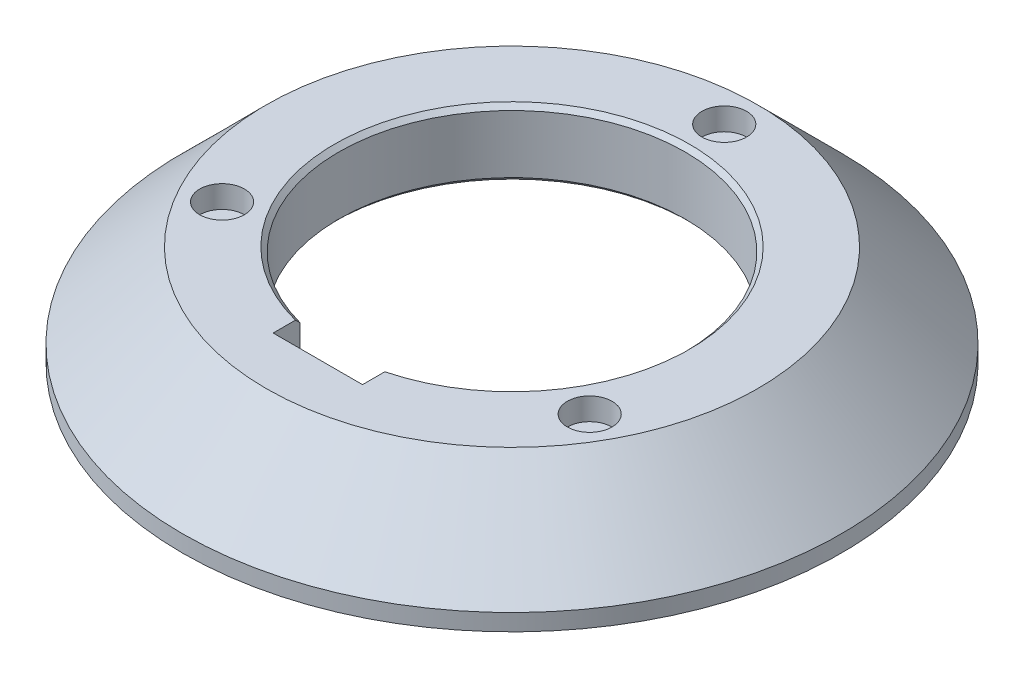
ISO-10303-21;
HEADER;
FILE_DESCRIPTION(('STEP AP214'),'2;1');
FILE_NAME('part.step','',(''),(''),'','','');
FILE_SCHEMA(('AUTOMOTIVE_DESIGN { 1 0 10303 214 1 1 1 1 }'));
ENDSEC;
DATA;
#1=APPLICATION_CONTEXT('core data for automotive mechanical design processes');
#2=APPLICATION_PROTOCOL_DEFINITION('international standard','automotive_design',2000,#1);
#3=PRODUCT_CONTEXT('',#1,'mechanical');
#4=PRODUCT('Part','Part','',(#3));
#5=PRODUCT_RELATED_PRODUCT_CATEGORY('part','',(#4));
#6=PRODUCT_DEFINITION_FORMATION('','',#4);
#7=PRODUCT_DEFINITION_CONTEXT('part definition',#1,'design');
#8=PRODUCT_DEFINITION('design','',#6,#7);
#9=PRODUCT_DEFINITION_SHAPE('','',#8);
#10=(LENGTH_UNIT() NAMED_UNIT(*) SI_UNIT(.MILLI.,.METRE.));
#11=(NAMED_UNIT(*) PLANE_ANGLE_UNIT() SI_UNIT($,.RADIAN.));
#12=(NAMED_UNIT(*) SI_UNIT($,.STERADIAN.) SOLID_ANGLE_UNIT());
#13=UNCERTAINTY_MEASURE_WITH_UNIT(LENGTH_MEASURE(1.E-05),#10,'distance_accuracy_value','');
#14=(GEOMETRIC_REPRESENTATION_CONTEXT(3) GLOBAL_UNCERTAINTY_ASSIGNED_CONTEXT((#13)) GLOBAL_UNIT_ASSIGNED_CONTEXT((#10,
#11,#12)) REPRESENTATION_CONTEXT('',''));
#15=CARTESIAN_POINT('',(0.,0.,0.));
#16=DIRECTION('',(0.,0.,1.));
#17=DIRECTION('',(1.,0.,0.));
#18=AXIS2_PLACEMENT_3D('',#15,#16,#17);
#19=CARTESIAN_POINT('',(110.,30.,0.));
#20=DIRECTION('',(0.,-1.,0.));
#21=DIRECTION('',(0.,0.,-1.));
#22=AXIS2_PLACEMENT_3D('',#19,#20,#21);
#23=PLANE('',#22);
#24=CARTESIAN_POINT('',(-82.2724133595215,30.,47.5000000000004));
#25=DIRECTION('',(0.,1.,0.));
#26=DIRECTION('',(0.866025403784436,0.,-0.500000000000004));
#27=AXIS2_PLACEMENT_3D('',#24,#25,#26);
#28=CIRCLE('',#27,10.);
#29=CARTESIAN_POINT('',(-73.6121593216771,30.,42.5000000000003));
#30=VERTEX_POINT('',#29);
#31=EDGE_CURVE('E131',#30,#30,#28,.T.);
#32=ORIENTED_EDGE('',*,*,#31,.F.);
#33=EDGE_LOOP('',(#32));
#34=FACE_BOUND('',#33,.T.);
#35=CARTESIAN_POINT('',(82.2724133595221,30.,47.4999999999992));
#36=DIRECTION('',(0.,1.,0.));
#37=DIRECTION('',(-0.866025403784443,0.,-0.499999999999992));
#38=AXIS2_PLACEMENT_3D('',#35,#36,#37);
#39=CIRCLE('',#38,10.);
#40=CARTESIAN_POINT('',(73.6121593216777,30.,42.4999999999993));
#41=VERTEX_POINT('',#40);
#42=EDGE_CURVE('E116',#41,#41,#39,.T.);
#43=ORIENTED_EDGE('',*,*,#42,.F.);
#44=EDGE_LOOP('',(#43));
#45=FACE_BOUND('',#44,.T.);
#46=CARTESIAN_POINT('',(0.,30.,-95.));
#47=DIRECTION('',(0.,1.,0.));
#48=DIRECTION('',(0.,0.,1.));
#49=AXIS2_PLACEMENT_3D('',#46,#47,#48);
#50=CIRCLE('',#49,10.);
#51=CARTESIAN_POINT('',(0.,30.,-85.));
#52=VERTEX_POINT('',#51);
#53=EDGE_CURVE('E130',#52,#52,#50,.T.);
#54=ORIENTED_EDGE('',*,*,#53,.F.);
#55=EDGE_LOOP('',(#54));
#56=FACE_BOUND('',#55,.T.);
#57=DIRECTION('',(-1.,0.,0.));
#58=VECTOR('',#57,1.);
#59=CARTESIAN_POINT('',(110.,30.,86.9));
#60=LINE('',#59,#58);
#61=CARTESIAN_POINT('',(20.,30.,86.9));
#62=VERTEX_POINT('',#61);
#63=CARTESIAN_POINT('',(-20.,30.,86.9));
#64=VERTEX_POINT('',#63);
#65=EDGE_CURVE('E107',#62,#64,#60,.T.);
#66=ORIENTED_EDGE('',*,*,#65,.T.);
#67=DIRECTION('',(0.,0.,-1.));
#68=VECTOR('',#67,1.);
#69=CARTESIAN_POINT('',(-20.,30.,0.));
#70=LINE('',#69,#68);
#71=CARTESIAN_POINT('',(-19.999999183372,30.0000087539034,76.943165574341));
#72=VERTEX_POINT('',#71);
#73=EDGE_CURVE('E118',#64,#72,#70,.T.);
#74=ORIENTED_EDGE('',*,*,#73,.T.);
#75=CARTESIAN_POINT('',(0.,30.,0.));
#76=DIRECTION('',(0.,-1.,0.));
#77=DIRECTION('',(0.,0.,-1.));
#78=AXIS2_PLACEMENT_3D('',#75,#76,#77);
#79=CIRCLE('',#78,79.5);
#80=CARTESIAN_POINT('',(19.9999991833721,30.0000087539034,76.943165574341));
#81=VERTEX_POINT('',#80);
#82=EDGE_CURVE('E166',#72,#81,#79,.T.);
#83=ORIENTED_EDGE('',*,*,#82,.T.);
#84=DIRECTION('',(0.,0.,1.));
#85=VECTOR('',#84,1.);
#86=CARTESIAN_POINT('',(20.,30.,0.));
#87=LINE('',#86,#85);
#88=EDGE_CURVE('E54',#81,#62,#87,.T.);
#89=ORIENTED_EDGE('',*,*,#88,.T.);
#90=EDGE_LOOP('',(#66,#74,#83,#89));
#91=FACE_BOUND('',#90,.T.);
#92=CARTESIAN_POINT('',(0.,30.,0.));
#93=DIRECTION('',(0.,1.,0.));
#94=DIRECTION('',(0.,0.,1.));
#95=AXIS2_PLACEMENT_3D('',#92,#93,#94);
#96=CIRCLE('',#95,110.);
#97=CARTESIAN_POINT('',(0.,30.,110.));
#98=VERTEX_POINT('',#97);
#99=EDGE_CURVE('E142',#98,#98,#96,.T.);
#100=ORIENTED_EDGE('',*,*,#99,.T.);
#101=EDGE_LOOP('',(#100));
#102=FACE_BOUND('',#101,.T.);
#103=ADVANCED_FACE('F37',(#34,#45,#56,#91,#102),#23,.F.);
#104=CARTESIAN_POINT('',(0.,107.750556792873,0.));
#105=DIRECTION('',(0.,1.,0.));
#106=DIRECTION('',(0.,0.,1.));
#107=AXIS2_PLACEMENT_3D('',#104,#105,#106);
#108=CYLINDRICAL_SURFACE('',#107,77.5);
#109=CARTESIAN_POINT('',(0.,28.,0.));
#110=DIRECTION('',(0.,-1.,0.));
#111=DIRECTION('',(0.,0.,-1.));
#112=AXIS2_PLACEMENT_3D('',#109,#110,#111);
#113=CIRCLE('',#112,77.5);
#114=CARTESIAN_POINT('',(20.,28.,74.8748956593597));
#115=VERTEX_POINT('',#114);
#116=CARTESIAN_POINT('',(-20.,28.,74.8748956593597));
#117=VERTEX_POINT('',#116);
#118=EDGE_CURVE('E160',#115,#117,#113,.F.);
#119=ORIENTED_EDGE('',*,*,#118,.T.);
#120=DIRECTION('',(0.,1.,0.));
#121=VECTOR('',#120,1.);
#122=CARTESIAN_POINT('',(-20.,107.750556792873,74.8748956593597));
#123=LINE('',#122,#121);
#124=CARTESIAN_POINT('',(-20.,2.00000000000003,74.8748956593597));
#125=VERTEX_POINT('',#124);
#126=EDGE_CURVE('E101',#117,#125,#123,.F.);
#127=ORIENTED_EDGE('',*,*,#126,.T.);
#128=CARTESIAN_POINT('',(0.,2.00000000000003,0.));
#129=DIRECTION('',(0.,1.,0.));
#130=DIRECTION('',(0.,0.,1.));
#131=AXIS2_PLACEMENT_3D('',#128,#129,#130);
#132=CIRCLE('',#131,77.5);
#133=CARTESIAN_POINT('',(20.,2.00000000000003,74.8748956593597));
#134=VERTEX_POINT('',#133);
#135=EDGE_CURVE('E163',#125,#134,#132,.F.);
#136=ORIENTED_EDGE('',*,*,#135,.T.);
#137=DIRECTION('',(0.,1.,0.));
#138=VECTOR('',#137,1.);
#139=CARTESIAN_POINT('',(20.,107.750556792873,74.8748956593597));
#140=LINE('',#139,#138);
#141=EDGE_CURVE('E108',#134,#115,#140,.T.);
#142=ORIENTED_EDGE('',*,*,#141,.T.);
#143=EDGE_LOOP('',(#119,#127,#136,#142));
#144=FACE_BOUND('',#143,.T.);
#145=ADVANCED_FACE('F209',(#144),#108,.F.);
#146=CARTESIAN_POINT('',(77.5,0.,0.));
#147=DIRECTION('',(0.,1.,0.));
#148=DIRECTION('',(0.,0.,1.));
#149=AXIS2_PLACEMENT_3D('',#146,#147,#148);
#150=PLANE('',#149);
#151=CARTESIAN_POINT('',(100.,0.,-3.49148133884313E-13));
#152=DIRECTION('',(0.,-1.,0.));
#153=DIRECTION('',(-1.,0.,0.));
#154=AXIS2_PLACEMENT_3D('',#151,#152,#153);
#155=CIRCLE('',#154,4.);
#156=CARTESIAN_POINT('',(96.,0.,-3.35182208528941E-13));
#157=VERTEX_POINT('',#156);
#158=EDGE_CURVE('E313',#157,#157,#155,.T.);
#159=ORIENTED_EDGE('',*,*,#158,.F.);
#160=EDGE_LOOP('',(#159));
#161=FACE_BOUND('',#160,.T.);
#162=CARTESIAN_POINT('',(70.7106781186544,0.,-70.7106781186551));
#163=DIRECTION('',(0.,-1.,0.));
#164=DIRECTION('',(-0.707106781186544,0.,0.707106781186551));
#165=AXIS2_PLACEMENT_3D('',#162,#163,#164);
#166=CIRCLE('',#165,4.);
#167=CARTESIAN_POINT('',(67.8822509939082,0.,-67.8822509939089));
#168=VERTEX_POINT('',#167);
#169=EDGE_CURVE('E307',#168,#168,#166,.T.);
#170=ORIENTED_EDGE('',*,*,#169,.F.);
#171=EDGE_LOOP('',(#170));
#172=FACE_BOUND('',#171,.T.);
#173=CARTESIAN_POINT('',(0.,0.,-100.));
#174=DIRECTION('',(0.,-1.,0.));
#175=DIRECTION('',(0.,0.,1.));
#176=AXIS2_PLACEMENT_3D('',#173,#174,#175);
#177=CIRCLE('',#176,4.);
#178=CARTESIAN_POINT('',(0.,0.,-96.));
#179=VERTEX_POINT('',#178);
#180=EDGE_CURVE('E301',#179,#179,#177,.T.);
#181=ORIENTED_EDGE('',*,*,#180,.F.);
#182=EDGE_LOOP('',(#181));
#183=FACE_BOUND('',#182,.T.);
#184=CARTESIAN_POINT('',(-70.7106781186554,0.,-70.7106781186541));
#185=DIRECTION('',(0.,-1.,0.));
#186=DIRECTION('',(0.707106781186554,0.,0.707106781186541));
#187=AXIS2_PLACEMENT_3D('',#184,#185,#186);
#188=CIRCLE('',#187,4.);
#189=CARTESIAN_POINT('',(-67.8822509939092,0.,-67.882250993908));
#190=VERTEX_POINT('',#189);
#191=EDGE_CURVE('E294',#190,#190,#188,.T.);
#192=ORIENTED_EDGE('',*,*,#191,.F.);
#193=EDGE_LOOP('',(#192));
#194=FACE_BOUND('',#193,.T.);
#195=CARTESIAN_POINT('',(-100.,0.,1.04744440165294E-12));
#196=DIRECTION('',(0.,-1.,0.));
#197=DIRECTION('',(1.,0.,0.));
#198=AXIS2_PLACEMENT_3D('',#195,#196,#197);
#199=CIRCLE('',#198,4.);
#200=CARTESIAN_POINT('',(-96.,0.,1.00554662558682E-12));
#201=VERTEX_POINT('',#200);
#202=EDGE_CURVE('E324',#201,#201,#199,.T.);
#203=ORIENTED_EDGE('',*,*,#202,.F.);
#204=EDGE_LOOP('',(#203));
#205=FACE_BOUND('',#204,.T.);
#206=CARTESIAN_POINT('',(-70.7106781186539,0.,70.7106781186556));
#207=DIRECTION('',(0.,-1.,0.));
#208=DIRECTION('',(0.707106781186539,0.,-0.707106781186556));
#209=AXIS2_PLACEMENT_3D('',#206,#207,#208);
#210=CIRCLE('',#209,4.);
#211=CARTESIAN_POINT('',(-67.8822509939077,0.,67.8822509939094));
#212=VERTEX_POINT('',#211);
#213=EDGE_CURVE('E318',#212,#212,#210,.T.);
#214=ORIENTED_EDGE('',*,*,#213,.F.);
#215=EDGE_LOOP('',(#214));
#216=FACE_BOUND('',#215,.T.);
#217=CARTESIAN_POINT('',(70.7106781186549,0.,70.7106781186546));
#218=DIRECTION('',(0.,-1.,0.));
#219=DIRECTION('',(-0.707106781186549,0.,-0.707106781186546));
#220=AXIS2_PLACEMENT_3D('',#217,#218,#219);
#221=CIRCLE('',#220,4.);
#222=CARTESIAN_POINT('',(67.8822509939087,0.,67.8822509939085));
#223=VERTEX_POINT('',#222);
#224=EDGE_CURVE('E288',#223,#223,#221,.T.);
#225=ORIENTED_EDGE('',*,*,#224,.F.);
#226=EDGE_LOOP('',(#225));
#227=FACE_BOUND('',#226,.T.);
#228=CARTESIAN_POINT('',(0.,0.,100.));
#229=DIRECTION('',(0.,-1.,0.));
#230=DIRECTION('',(0.,0.,-1.));
#231=AXIS2_PLACEMENT_3D('',#228,#229,#230);
#232=CIRCLE('',#231,4.);
#233=CARTESIAN_POINT('',(0.,0.,96.));
#234=VERTEX_POINT('',#233);
#235=EDGE_CURVE('E282',#234,#234,#232,.T.);
#236=ORIENTED_EDGE('',*,*,#235,.F.);
#237=EDGE_LOOP('',(#236));
#238=FACE_BOUND('',#237,.T.);
#239=CARTESIAN_POINT('',(0.,0.,0.));
#240=DIRECTION('',(0.,1.,0.));
#241=DIRECTION('',(0.,0.,1.));
#242=AXIS2_PLACEMENT_3D('',#239,#240,#241);
#243=CIRCLE('',#242,79.5);
#244=CARTESIAN_POINT('',(20.,0.,76.9431608396744));
#245=VERTEX_POINT('',#244);
#246=CARTESIAN_POINT('',(-20.,0.,76.9431608396744));
#247=VERTEX_POINT('',#246);
#248=EDGE_CURVE('E113',#245,#247,#243,.T.);
#249=ORIENTED_EDGE('',*,*,#248,.T.);
#250=DIRECTION('',(0.,0.,1.));
#251=VECTOR('',#250,1.);
#252=CARTESIAN_POINT('',(-20.,0.,0.));
#253=LINE('',#252,#251);
#254=CARTESIAN_POINT('',(-20.,0.,86.9));
#255=VERTEX_POINT('',#254);
#256=EDGE_CURVE('E62',#247,#255,#253,.T.);
#257=ORIENTED_EDGE('',*,*,#256,.T.);
#258=DIRECTION('',(1.,0.,0.));
#259=VECTOR('',#258,1.);
#260=CARTESIAN_POINT('',(77.5,0.,86.9));
#261=LINE('',#260,#259);
#262=CARTESIAN_POINT('',(20.,0.,86.9));
#263=VERTEX_POINT('',#262);
#264=EDGE_CURVE('E11',#255,#263,#261,.T.);
#265=ORIENTED_EDGE('',*,*,#264,.T.);
#266=DIRECTION('',(0.,0.,-1.));
#267=VECTOR('',#266,1.);
#268=CARTESIAN_POINT('',(20.,0.,0.));
#269=LINE('',#268,#267);
#270=EDGE_CURVE('E92',#263,#245,#269,.T.);
#271=ORIENTED_EDGE('',*,*,#270,.T.);
#272=EDGE_LOOP('',(#249,#257,#265,#271));
#273=FACE_BOUND('',#272,.T.);
#274=CARTESIAN_POINT('',(0.,0.,0.));
#275=DIRECTION('',(0.,1.,0.));
#276=DIRECTION('',(0.,0.,1.));
#277=AXIS2_PLACEMENT_3D('',#274,#275,#276);
#278=CIRCLE('',#277,117.5);
#279=CARTESIAN_POINT('',(0.,0.,117.5));
#280=VERTEX_POINT('',#279);
#281=EDGE_CURVE('E156',#280,#280,#278,.T.);
#282=ORIENTED_EDGE('',*,*,#281,.F.);
#283=EDGE_LOOP('',(#282));
#284=FACE_BOUND('',#283,.T.);
#285=ADVANCED_FACE('F111',(#161,#172,#183,#194,#205,#216,#227,#238,#273,#284),#150,.F.);
#286=CARTESIAN_POINT('',(0.,0.,0.));
#287=DIRECTION('',(0.,-1.,0.));
#288=DIRECTION('',(0.,0.,-1.));
#289=AXIS2_PLACEMENT_3D('',#286,#287,#288);
#290=CONICAL_SURFACE('',#289,117.5,0.785398163397447);
#291=CARTESIAN_POINT('',(0.,-15.,0.));
#292=DIRECTION('',(0.,1.,0.));
#293=DIRECTION('',(0.,0.,1.));
#294=AXIS2_PLACEMENT_3D('',#291,#292,#293);
#295=CIRCLE('',#294,132.5);
#296=CARTESIAN_POINT('',(0.,-15.,132.5));
#297=VERTEX_POINT('',#296);
#298=EDGE_CURVE('E153',#297,#297,#295,.T.);
#299=ORIENTED_EDGE('',*,*,#298,.F.);
#300=EDGE_LOOP('',(#299));
#301=FACE_BOUND('',#300,.T.);
#302=ORIENTED_EDGE('',*,*,#281,.T.);
#303=EDGE_LOOP('',(#302));
#304=FACE_BOUND('',#303,.T.);
#305=ADVANCED_FACE('F216',(#301,#304),#290,.F.);
#306=CARTESIAN_POINT('',(132.5,-15.,0.));
#307=DIRECTION('',(0.,1.,0.));
#308=DIRECTION('',(0.,0.,1.));
#309=AXIS2_PLACEMENT_3D('',#306,#307,#308);
#310=PLANE('',#309);
#311=CARTESIAN_POINT('',(0.,-15.,0.));
#312=DIRECTION('',(0.,1.,0.));
#313=DIRECTION('',(0.,0.,1.));
#314=AXIS2_PLACEMENT_3D('',#311,#312,#313);
#315=CIRCLE('',#314,147.5);
#316=CARTESIAN_POINT('',(0.,-15.,147.5));
#317=VERTEX_POINT('',#316);
#318=EDGE_CURVE('E150',#317,#317,#315,.T.);
#319=ORIENTED_EDGE('',*,*,#318,.F.);
#320=EDGE_LOOP('',(#319));
#321=FACE_BOUND('',#320,.T.);
#322=ORIENTED_EDGE('',*,*,#298,.T.);
#323=EDGE_LOOP('',(#322));
#324=FACE_BOUND('',#323,.T.);
#325=ADVANCED_FACE('F220',(#321,#324),#310,.F.);
#326=CARTESIAN_POINT('',(0.,107.750556792873,0.));
#327=DIRECTION('',(0.,1.,0.));
#328=DIRECTION('',(0.,0.,1.));
#329=AXIS2_PLACEMENT_3D('',#326,#327,#328);
#330=CYLINDRICAL_SURFACE('',#329,147.5);
#331=CARTESIAN_POINT('',(0.,-7.5000000000001,0.));
#332=DIRECTION('',(0.,1.,0.));
#333=DIRECTION('',(0.,0.,1.));
#334=AXIS2_PLACEMENT_3D('',#331,#332,#333);
#335=CIRCLE('',#334,147.5);
#336=CARTESIAN_POINT('',(0.,-7.5000000000001,147.5));
#337=VERTEX_POINT('',#336);
#338=EDGE_CURVE('E147',#337,#337,#335,.T.);
#339=ORIENTED_EDGE('',*,*,#338,.F.);
#340=EDGE_LOOP('',(#339));
#341=FACE_BOUND('',#340,.T.);
#342=ORIENTED_EDGE('',*,*,#318,.T.);
#343=EDGE_LOOP('',(#342));
#344=FACE_BOUND('',#343,.T.);
#345=ADVANCED_FACE('F224',(#341,#344),#330,.T.);
#346=CARTESIAN_POINT('',(0.,-7.5000000000001,0.));
#347=DIRECTION('',(0.,-1.,0.));
#348=DIRECTION('',(0.,0.,-1.));
#349=AXIS2_PLACEMENT_3D('',#346,#347,#348);
#350=CONICAL_SURFACE('',#349,147.5,0.785398163397447);
#351=ORIENTED_EDGE('',*,*,#99,.F.);
#352=EDGE_LOOP('',(#351));
#353=FACE_BOUND('',#352,.T.);
#354=ORIENTED_EDGE('',*,*,#338,.T.);
#355=EDGE_LOOP('',(#354));
#356=FACE_BOUND('',#355,.T.);
#357=ADVANCED_FACE('F204',(#353,#356),#350,.T.);
#358=CARTESIAN_POINT('',(0.,0.,0.));
#359=DIRECTION('',(0.,-1.,0.));
#360=DIRECTION('',(0.,0.,-1.));
#361=AXIS2_PLACEMENT_3D('',#358,#359,#360);
#362=CONICAL_SURFACE('',#361,79.5,0.785398163397441);
#363=CARTESIAN_POINT('',(-20.,-17.5684312119772,94.9856849106975));
#364=CARTESIAN_POINT('',(-20.,-16.0097924913469,93.3928472974872));
#365=CARTESIAN_POINT('',(-20.,-14.4519817757735,91.7991986225075));
#366=CARTESIAN_POINT('',(-20.,-11.3383457901811,88.6099617932942));
#367=CARTESIAN_POINT('',(-20.,-9.78252052094745,87.0143736382942));
#368=CARTESIAN_POINT('',(-20.,-6.67321620346296,83.8209726736292));
#369=CARTESIAN_POINT('',(-20.,-5.11973711035972,82.2231599076445));
#370=CARTESIAN_POINT('',(-20.,-2.01552747081061,79.02486686309));
#371=CARTESIAN_POINT('',(-20.,-0.4647969237774,77.4243865850903));
#372=CARTESIAN_POINT('',(-20.,2.63339750207828,74.2202237529315));
#373=CARTESIAN_POINT('',(-20.,4.18086133553764,72.6165411548974));
#374=CARTESIAN_POINT('',(-20.,7.271804411606,69.4053439372526));
#375=CARTESIAN_POINT('',(-20.,8.81528365975796,67.7978293229788));
#376=CARTESIAN_POINT('',(-20.,11.8973897349149,64.5780925799859));
#377=CARTESIAN_POINT('',(-20.,13.4360164677237,62.9658703610395));
#378=CARTESIAN_POINT('',(-20.,15.7393910224165,60.5431891470597));
#379=CARTESIAN_POINT('',(-20.,16.5064234991292,59.7349020997113));
#380=CARTESIAN_POINT('',(-20.,18.0387677175682,58.1166970803101));
#381=CARTESIAN_POINT('',(-20.,18.8040794574747,57.3067791065341));
#382=CARTESIAN_POINT('',(-20.,19.5684312119773,56.49595505338));
#383=B_SPLINE_CURVE_WITH_KNOTS('',3,(#363,#364,#365,#366,#367,#368,#369,#370,#371,#372,#373,
#374,#375,#376,#377,#378,#379,#380,#381,#382),.UNSPECIFIED.,.F.,.F.,(4,2,2,2,2,2,2,2,2,4),(0.,
6.68568506223245,13.3713727677386,20.0569310011246,26.742487805724,33.4281368463093,
40.1137765814846,46.7995453080812,50.1424461297198,53.4853504850127),.UNSPECIFIED.);
#384=EDGE_CURVE('E114',#247,#125,#383,.T.);
#385=ORIENTED_EDGE('',*,*,#384,.F.);
#386=ORIENTED_EDGE('',*,*,#248,.F.);
#387=CARTESIAN_POINT('',(20.,19.5684312119773,56.49595505338));
#388=CARTESIAN_POINT('',(20.,18.8040794574747,57.3067791065341));
#389=CARTESIAN_POINT('',(20.,18.0387677175682,58.11669708031));
#390=CARTESIAN_POINT('',(20.,16.5064234991293,59.7349020997113));
#391=CARTESIAN_POINT('',(20.,15.7393910224165,60.5431891470597));
#392=CARTESIAN_POINT('',(20.,13.4360164677237,62.9658703610395));
#393=CARTESIAN_POINT('',(20.,11.8973897349149,64.5780925799859));
#394=CARTESIAN_POINT('',(20.,8.81528365975795,67.7978293229788));
#395=CARTESIAN_POINT('',(20.,7.27180441160599,69.4053439372526));
#396=CARTESIAN_POINT('',(20.,4.18086133553762,72.6165411548974));
#397=CARTESIAN_POINT('',(20.,2.63339750207826,74.2202237529315));
#398=CARTESIAN_POINT('',(20.,-0.464796923777415,77.4243865850904));
#399=CARTESIAN_POINT('',(20.,-2.01552747081062,79.02486686309));
#400=CARTESIAN_POINT('',(20.,-5.11973711035974,82.2231599076445));
#401=CARTESIAN_POINT('',(20.,-6.67321620346298,83.8209726736293));
#402=CARTESIAN_POINT('',(20.,-9.78252052094747,87.0143736382942));
#403=CARTESIAN_POINT('',(20.,-11.3383457901812,88.6099617932942));
#404=CARTESIAN_POINT('',(20.,-14.4519817757735,91.7991986225075));
#405=CARTESIAN_POINT('',(20.,-16.0097924913469,93.3928472974872));
#406=CARTESIAN_POINT('',(20.,-17.5684312119773,94.9856849106975));
#407=B_SPLINE_CURVE_WITH_KNOTS('',3,(#387,#388,#389,#390,#391,#392,#393,#394,#395,#396,#397,
#398,#399,#400,#401,#402,#403,#404,#405,#406),.UNSPECIFIED.,.F.,.F.,(4,2,2,2,2,2,2,2,2,4),(0.,
3.34290435529286,6.68580517693152,13.3715739035281,20.0572136387034,26.7428626792887,
33.4284194838881,40.1139777172742,46.7996654227803,53.4853504850127),.UNSPECIFIED.);
#408=EDGE_CURVE('E97',#134,#245,#407,.T.);
#409=ORIENTED_EDGE('',*,*,#408,.F.);
#410=ORIENTED_EDGE('',*,*,#135,.F.);
#411=EDGE_LOOP('',(#385,#386,#409,#410));
#412=FACE_BOUND('',#411,.T.);
#413=ADVANCED_FACE('F198',(#412),#362,.F.);
#414=CARTESIAN_POINT('',(0.,28.,0.));
#415=DIRECTION('',(0.,1.,0.));
#416=DIRECTION('',(0.,0.,1.));
#417=AXIS2_PLACEMENT_3D('',#414,#415,#416);
#418=CONICAL_SURFACE('',#417,77.5,0.785398163397438);
#419=CARTESIAN_POINT('',(-20.,10.4315687880228,56.4959550533802));
#420=CARTESIAN_POINT('',(-20.,11.1959205425254,57.3067791065343));
#421=CARTESIAN_POINT('',(-20.,11.9612322824319,58.1166970803102));
#422=CARTESIAN_POINT('',(-20.,13.4935765008708,59.7349020997115));
#423=CARTESIAN_POINT('',(-20.,14.2606089775835,60.5431891470599));
#424=CARTESIAN_POINT('',(-20.,16.5639835322763,62.9658703610396));
#425=CARTESIAN_POINT('',(-20.,18.1026102650851,64.578092579986));
#426=CARTESIAN_POINT('',(-20.,21.1847163402421,67.7978293229788));
#427=CARTESIAN_POINT('',(-20.,22.7281955883941,69.4053439372527));
#428=CARTESIAN_POINT('',(-20.,25.8191386644624,72.6165411548974));
#429=CARTESIAN_POINT('',(-20.,27.3666024979218,74.2202237529315));
#430=CARTESIAN_POINT('',(-20.,30.4647969237774,77.4243865850903));
#431=CARTESIAN_POINT('',(-20.,32.0155274708106,79.0248668630899));
#432=CARTESIAN_POINT('',(-20.,35.1197371103597,82.2231599076444));
#433=CARTESIAN_POINT('',(-20.,36.673216203463,83.8209726736291));
#434=CARTESIAN_POINT('',(-20.,39.7825205209474,87.014373638294));
#435=CARTESIAN_POINT('',(-20.,41.3383457901811,88.6099617932941));
#436=CARTESIAN_POINT('',(-20.,44.4519817757734,91.7991986225073));
#437=CARTESIAN_POINT('',(-20.,46.0097924913468,93.392847297487));
#438=CARTESIAN_POINT('',(-20.,47.5684312119772,94.9856849106973));
#439=B_SPLINE_CURVE_WITH_KNOTS('',3,(#419,#420,#421,#422,#423,#424,#425,#426,#427,#428,#429,
#430,#431,#432,#433,#434,#435,#436,#437,#438),.UNSPECIFIED.,.F.,.F.,(4,2,2,2,2,2,2,2,2,4),(0.,
3.34290435529283,6.68580517693147,13.371573903528,20.0572136387032,26.7428626792885,
33.4284194838878,40.1139777172738,46.7996654227799,53.4853504850123),.UNSPECIFIED.);
#440=EDGE_CURVE('E47',#117,#72,#439,.T.);
#441=ORIENTED_EDGE('',*,*,#440,.F.);
#442=ORIENTED_EDGE('',*,*,#118,.F.);
#443=CARTESIAN_POINT('',(20.,47.5684312119772,94.9856849106973));
#444=CARTESIAN_POINT('',(20.,46.0097924913468,93.392847297487));
#445=CARTESIAN_POINT('',(20.,44.4519817757734,91.7991986225073));
#446=CARTESIAN_POINT('',(20.,41.3383457901811,88.6099617932941));
#447=CARTESIAN_POINT('',(20.,39.7825205209474,87.014373638294));
#448=CARTESIAN_POINT('',(20.,36.673216203463,83.8209726736291));
#449=CARTESIAN_POINT('',(20.,35.1197371103597,82.2231599076444));
#450=CARTESIAN_POINT('',(20.,32.0155274708106,79.0248668630899));
#451=CARTESIAN_POINT('',(20.,30.4647969237774,77.4243865850903));
#452=CARTESIAN_POINT('',(20.,27.3666024979218,74.2202237529315));
#453=CARTESIAN_POINT('',(20.,25.8191386644624,72.6165411548974));
#454=CARTESIAN_POINT('',(20.,22.7281955883941,69.4053439372527));
#455=CARTESIAN_POINT('',(20.,21.1847163402421,67.7978293229788));
#456=CARTESIAN_POINT('',(20.,18.1026102650851,64.578092579986));
#457=CARTESIAN_POINT('',(20.,16.5639835322763,62.9658703610396));
#458=CARTESIAN_POINT('',(20.,14.2606089775835,60.5431891470599));
#459=CARTESIAN_POINT('',(20.,13.4935765008708,59.7349020997115));
#460=CARTESIAN_POINT('',(20.,11.9612322824319,58.1166970803102));
#461=CARTESIAN_POINT('',(20.,11.1959205425254,57.3067791065343));
#462=CARTESIAN_POINT('',(20.,10.4315687880228,56.4959550533802));
#463=B_SPLINE_CURVE_WITH_KNOTS('',3,(#443,#444,#445,#446,#447,#448,#449,#450,#451,#452,#453,
#454,#455,#456,#457,#458,#459,#460,#461,#462),.UNSPECIFIED.,.F.,.F.,(4,2,2,2,2,2,2,2,2,4),(0.,
6.68568506223239,13.3713727677384,20.0569310011245,26.7424878057238,33.4281368463091,
40.1137765814843,46.7995453080808,50.1424461297195,53.4853504850123),.UNSPECIFIED.);
#464=EDGE_CURVE('E171',#81,#115,#463,.T.);
#465=ORIENTED_EDGE('',*,*,#464,.F.);
#466=ORIENTED_EDGE('',*,*,#82,.F.);
#467=EDGE_LOOP('',(#441,#442,#465,#466));
#468=FACE_BOUND('',#467,.T.);
#469=ADVANCED_FACE('F40',(#468),#418,.F.);
#470=CARTESIAN_POINT('',(0.,20.,-95.));
#471=DIRECTION('',(0.,1.,0.));
#472=DIRECTION('',(0.,0.,1.));
#473=AXIS2_PLACEMENT_3D('',#470,#471,#472);
#474=CYLINDRICAL_SURFACE('',#473,10.);
#475=CARTESIAN_POINT('',(0.,20.,-95.));
#476=DIRECTION('',(0.,1.,0.));
#477=DIRECTION('',(0.,0.,1.));
#478=AXIS2_PLACEMENT_3D('',#475,#476,#477);
#479=CIRCLE('',#478,10.);
#480=CARTESIAN_POINT('',(0.,20.,-85.));
#481=VERTEX_POINT('',#480);
#482=EDGE_CURVE('E139',#481,#481,#479,.T.);
#483=ORIENTED_EDGE('',*,*,#482,.F.);
#484=EDGE_LOOP('',(#483));
#485=FACE_BOUND('',#484,.T.);
#486=ORIENTED_EDGE('',*,*,#53,.T.);
#487=EDGE_LOOP('',(#486));
#488=FACE_BOUND('',#487,.T.);
#489=ADVANCED_FACE('F232',(#485,#488),#474,.F.);
#490=CARTESIAN_POINT('',(0.,20.,-95.));
#491=DIRECTION('',(0.,1.,0.));
#492=DIRECTION('',(0.,0.,1.));
#493=AXIS2_PLACEMENT_3D('',#490,#491,#492);
#494=PLANE('',#493);
#495=ORIENTED_EDGE('',*,*,#482,.T.);
#496=EDGE_LOOP('',(#495));
#497=FACE_BOUND('',#496,.T.);
#498=ADVANCED_FACE('F235',(#497),#494,.T.);
#499=CARTESIAN_POINT('',(82.2724133595221,20.,47.4999999999992));
#500=DIRECTION('',(0.,1.,0.));
#501=DIRECTION('',(0.,0.,1.));
#502=AXIS2_PLACEMENT_3D('',#499,#500,#501);
#503=CYLINDRICAL_SURFACE('',#502,10.);
#504=CARTESIAN_POINT('',(82.2724133595221,20.,47.4999999999992));
#505=DIRECTION('',(0.,1.,0.));
#506=DIRECTION('',(-0.866025403784443,0.,-0.499999999999992));
#507=AXIS2_PLACEMENT_3D('',#504,#505,#506);
#508=CIRCLE('',#507,10.);
#509=CARTESIAN_POINT('',(73.6121593216777,20.,42.4999999999993));
#510=VERTEX_POINT('',#509);
#511=EDGE_CURVE('E134',#510,#510,#508,.T.);
#512=ORIENTED_EDGE('',*,*,#511,.F.);
#513=EDGE_LOOP('',(#512));
#514=FACE_BOUND('',#513,.T.);
#515=ORIENTED_EDGE('',*,*,#42,.T.);
#516=EDGE_LOOP('',(#515));
#517=FACE_BOUND('',#516,.T.);
#518=ADVANCED_FACE('F239',(#514,#517),#503,.F.);
#519=CARTESIAN_POINT('',(82.2724133595221,20.,47.4999999999992));
#520=DIRECTION('',(0.,1.,0.));
#521=DIRECTION('',(-0.866025403784443,0.,-0.499999999999992));
#522=AXIS2_PLACEMENT_3D('',#519,#520,#521);
#523=PLANE('',#522);
#524=ORIENTED_EDGE('',*,*,#511,.T.);
#525=EDGE_LOOP('',(#524));
#526=FACE_BOUND('',#525,.T.);
#527=ADVANCED_FACE('F243',(#526),#523,.T.);
#528=CARTESIAN_POINT('',(-82.2724133595215,20.,47.5000000000004));
#529=DIRECTION('',(0.,1.,0.));
#530=DIRECTION('',(0.,0.,1.));
#531=AXIS2_PLACEMENT_3D('',#528,#529,#530);
#532=CYLINDRICAL_SURFACE('',#531,10.);
#533=CARTESIAN_POINT('',(-82.2724133595215,20.,47.5000000000004));
#534=DIRECTION('',(0.,1.,0.));
#535=DIRECTION('',(0.866025403784436,0.,-0.500000000000004));
#536=AXIS2_PLACEMENT_3D('',#533,#534,#535);
#537=CIRCLE('',#536,10.);
#538=CARTESIAN_POINT('',(-73.6121593216771,20.,42.5000000000003));
#539=VERTEX_POINT('',#538);
#540=EDGE_CURVE('E127',#539,#539,#537,.T.);
#541=ORIENTED_EDGE('',*,*,#540,.F.);
#542=EDGE_LOOP('',(#541));
#543=FACE_BOUND('',#542,.T.);
#544=ORIENTED_EDGE('',*,*,#31,.T.);
#545=EDGE_LOOP('',(#544));
#546=FACE_BOUND('',#545,.T.);
#547=ADVANCED_FACE('F247',(#543,#546),#532,.F.);
#548=CARTESIAN_POINT('',(-82.2724133595215,20.,47.5000000000004));
#549=DIRECTION('',(0.,1.,0.));
#550=DIRECTION('',(0.866025403784436,0.,-0.500000000000004));
#551=AXIS2_PLACEMENT_3D('',#548,#549,#550);
#552=PLANE('',#551);
#553=ORIENTED_EDGE('',*,*,#540,.T.);
#554=EDGE_LOOP('',(#553));
#555=FACE_BOUND('',#554,.T.);
#556=ADVANCED_FACE('F251',(#555),#552,.T.);
#557=CARTESIAN_POINT('',(-20.,-15.,86.9));
#558=DIRECTION('',(0.,0.,1.));
#559=DIRECTION('',(1.,0.,0.));
#560=AXIS2_PLACEMENT_3D('',#557,#558,#559);
#561=PLANE('',#560);
#562=DIRECTION('',(0.,1.,0.));
#563=VECTOR('',#562,1.);
#564=CARTESIAN_POINT('',(20.,-15.,86.9));
#565=LINE('',#564,#563);
#566=EDGE_CURVE('E95',#263,#62,#565,.T.);
#567=ORIENTED_EDGE('',*,*,#566,.F.);
#568=ORIENTED_EDGE('',*,*,#264,.F.);
#569=DIRECTION('',(0.,1.,0.));
#570=VECTOR('',#569,1.);
#571=CARTESIAN_POINT('',(-20.,-15.,86.9));
#572=LINE('',#571,#570);
#573=EDGE_CURVE('E109',#255,#64,#572,.T.);
#574=ORIENTED_EDGE('',*,*,#573,.T.);
#575=ORIENTED_EDGE('',*,*,#65,.F.);
#576=EDGE_LOOP('',(#567,#568,#574,#575));
#577=FACE_BOUND('',#576,.T.);
#578=ADVANCED_FACE('F104',(#577),#561,.F.);
#579=CARTESIAN_POINT('',(-20.,-15.,62.0459818976406));
#580=DIRECTION('',(-1.,0.,0.));
#581=DIRECTION('',(0.,0.,1.));
#582=AXIS2_PLACEMENT_3D('',#579,#580,#581);
#583=PLANE('',#582);
#584=ORIENTED_EDGE('',*,*,#384,.T.);
#585=ORIENTED_EDGE('',*,*,#126,.F.);
#586=ORIENTED_EDGE('',*,*,#440,.T.);
#587=ORIENTED_EDGE('',*,*,#73,.F.);
#588=ORIENTED_EDGE('',*,*,#573,.F.);
#589=ORIENTED_EDGE('',*,*,#256,.F.);
#590=EDGE_LOOP('',(#584,#585,#586,#587,#588,#589));
#591=FACE_BOUND('',#590,.T.);
#592=ADVANCED_FACE('F185',(#591),#583,.F.);
#593=CARTESIAN_POINT('',(20.,-15.,86.9));
#594=DIRECTION('',(1.,0.,0.));
#595=DIRECTION('',(0.,0.,-1.));
#596=AXIS2_PLACEMENT_3D('',#593,#594,#595);
#597=PLANE('',#596);
#598=ORIENTED_EDGE('',*,*,#566,.T.);
#599=ORIENTED_EDGE('',*,*,#88,.F.);
#600=ORIENTED_EDGE('',*,*,#464,.T.);
#601=ORIENTED_EDGE('',*,*,#141,.F.);
#602=ORIENTED_EDGE('',*,*,#408,.T.);
#603=ORIENTED_EDGE('',*,*,#270,.F.);
#604=EDGE_LOOP('',(#598,#599,#600,#601,#602,#603));
#605=FACE_BOUND('',#604,.T.);
#606=ADVANCED_FACE('F94',(#605),#597,.F.);
#607=CARTESIAN_POINT('',(0.,8.,100.));
#608=DIRECTION('',(0.,-1.,0.));
#609=DIRECTION('',(0.,0.,-1.));
#610=AXIS2_PLACEMENT_3D('',#607,#608,#609);
#611=CYLINDRICAL_SURFACE('',#610,4.);
#612=CARTESIAN_POINT('',(0.,8.,100.));
#613=DIRECTION('',(0.,-1.,0.));
#614=DIRECTION('',(0.,0.,-1.));
#615=AXIS2_PLACEMENT_3D('',#612,#613,#614);
#616=CIRCLE('',#615,4.);
#617=CARTESIAN_POINT('',(0.,8.,96.));
#618=VERTEX_POINT('',#617);
#619=EDGE_CURVE('E280',#618,#618,#616,.T.);
#620=ORIENTED_EDGE('',*,*,#619,.F.);
#621=EDGE_LOOP('',(#620));
#622=FACE_BOUND('',#621,.T.);
#623=ORIENTED_EDGE('',*,*,#235,.T.);
#624=EDGE_LOOP('',(#623));
#625=FACE_BOUND('',#624,.T.);
#626=ADVANCED_FACE('F184',(#622,#625),#611,.F.);
#627=CARTESIAN_POINT('',(0.,8.,100.));
#628=DIRECTION('',(0.,-1.,0.));
#629=DIRECTION('',(0.,0.,-1.));
#630=AXIS2_PLACEMENT_3D('',#627,#628,#629);
#631=PLANE('',#630);
#632=ORIENTED_EDGE('',*,*,#619,.T.);
#633=EDGE_LOOP('',(#632));
#634=FACE_BOUND('',#633,.T.);
#635=ADVANCED_FACE('F347',(#634),#631,.T.);
#636=CARTESIAN_POINT('',(70.7106781186549,8.,70.7106781186546));
#637=DIRECTION('',(0.,-1.,0.));
#638=DIRECTION('',(0.,0.,-1.));
#639=AXIS2_PLACEMENT_3D('',#636,#637,#638);
#640=CYLINDRICAL_SURFACE('',#639,4.);
#641=CARTESIAN_POINT('',(70.7106781186549,8.,70.7106781186546));
#642=DIRECTION('',(0.,-1.,0.));
#643=DIRECTION('',(-0.707106781186549,0.,-0.707106781186546));
#644=AXIS2_PLACEMENT_3D('',#641,#642,#643);
#645=CIRCLE('',#644,4.);
#646=CARTESIAN_POINT('',(67.8822509939087,8.,67.8822509939085));
#647=VERTEX_POINT('',#646);
#648=EDGE_CURVE('E285',#647,#647,#645,.T.);
#649=ORIENTED_EDGE('',*,*,#648,.F.);
#650=EDGE_LOOP('',(#649));
#651=FACE_BOUND('',#650,.T.);
#652=ORIENTED_EDGE('',*,*,#224,.T.);
#653=EDGE_LOOP('',(#652));
#654=FACE_BOUND('',#653,.T.);
#655=ADVANCED_FACE('F352',(#651,#654),#640,.F.);
#656=CARTESIAN_POINT('',(70.7106781186549,8.,70.7106781186546));
#657=DIRECTION('',(0.,-1.,0.));
#658=DIRECTION('',(-0.707106781186549,0.,-0.707106781186546));
#659=AXIS2_PLACEMENT_3D('',#656,#657,#658);
#660=PLANE('',#659);
#661=ORIENTED_EDGE('',*,*,#648,.T.);
#662=EDGE_LOOP('',(#661));
#663=FACE_BOUND('',#662,.T.);
#664=ADVANCED_FACE('F358',(#663),#660,.T.);
#665=CARTESIAN_POINT('',(-70.7106781186539,8.,70.7106781186556));
#666=DIRECTION('',(0.,-1.,0.));
#667=DIRECTION('',(0.,0.,-1.));
#668=AXIS2_PLACEMENT_3D('',#665,#666,#667);
#669=CYLINDRICAL_SURFACE('',#668,4.);
#670=CARTESIAN_POINT('',(-70.7106781186539,8.,70.7106781186556));
#671=DIRECTION('',(0.,-1.,0.));
#672=DIRECTION('',(0.707106781186539,0.,-0.707106781186556));
#673=AXIS2_PLACEMENT_3D('',#670,#671,#672);
#674=CIRCLE('',#673,4.);
#675=CARTESIAN_POINT('',(-67.8822509939077,8.,67.8822509939094));
#676=VERTEX_POINT('',#675);
#677=EDGE_CURVE('E321',#676,#676,#674,.T.);
#678=ORIENTED_EDGE('',*,*,#677,.F.);
#679=EDGE_LOOP('',(#678));
#680=FACE_BOUND('',#679,.T.);
#681=ORIENTED_EDGE('',*,*,#213,.T.);
#682=EDGE_LOOP('',(#681));
#683=FACE_BOUND('',#682,.T.);
#684=ADVANCED_FACE('F364',(#680,#683),#669,.F.);
#685=CARTESIAN_POINT('',(-70.7106781186539,8.,70.7106781186556));
#686=DIRECTION('',(0.,-1.,0.));
#687=DIRECTION('',(0.707106781186539,0.,-0.707106781186556));
#688=AXIS2_PLACEMENT_3D('',#685,#686,#687);
#689=PLANE('',#688);
#690=ORIENTED_EDGE('',*,*,#677,.T.);
#691=EDGE_LOOP('',(#690));
#692=FACE_BOUND('',#691,.T.);
#693=ADVANCED_FACE('F335',(#692),#689,.T.);
#694=CARTESIAN_POINT('',(-100.,8.,1.04744440165294E-12));
#695=DIRECTION('',(0.,-1.,0.));
#696=DIRECTION('',(0.,0.,-1.));
#697=AXIS2_PLACEMENT_3D('',#694,#695,#696);
#698=CYLINDRICAL_SURFACE('',#697,4.);
#699=CARTESIAN_POINT('',(-100.,8.,1.04744440165294E-12));
#700=DIRECTION('',(0.,-1.,0.));
#701=DIRECTION('',(1.,0.,0.));
#702=AXIS2_PLACEMENT_3D('',#699,#700,#701);
#703=CIRCLE('',#702,4.);
#704=CARTESIAN_POINT('',(-96.,8.,1.00554662558682E-12));
#705=VERTEX_POINT('',#704);
#706=EDGE_CURVE('E298',#705,#705,#703,.T.);
#707=ORIENTED_EDGE('',*,*,#706,.F.);
#708=EDGE_LOOP('',(#707));
#709=FACE_BOUND('',#708,.T.);
#710=ORIENTED_EDGE('',*,*,#202,.T.);
#711=EDGE_LOOP('',(#710));
#712=FACE_BOUND('',#711,.T.);
#713=ADVANCED_FACE('F332',(#709,#712),#698,.F.);
#714=CARTESIAN_POINT('',(-100.,8.,1.04744440165294E-12));
#715=DIRECTION('',(0.,-1.,0.));
#716=DIRECTION('',(1.,0.,0.));
#717=AXIS2_PLACEMENT_3D('',#714,#715,#716);
#718=PLANE('',#717);
#719=ORIENTED_EDGE('',*,*,#706,.T.);
#720=EDGE_LOOP('',(#719));
#721=FACE_BOUND('',#720,.T.);
#722=ADVANCED_FACE('F330',(#721),#718,.T.);
#723=CARTESIAN_POINT('',(-70.7106781186554,8.,-70.7106781186541));
#724=DIRECTION('',(0.,-1.,0.));
#725=DIRECTION('',(0.,0.,-1.));
#726=AXIS2_PLACEMENT_3D('',#723,#724,#725);
#727=CYLINDRICAL_SURFACE('',#726,4.);
#728=CARTESIAN_POINT('',(-70.7106781186554,8.,-70.7106781186541));
#729=DIRECTION('',(0.,-1.,0.));
#730=DIRECTION('',(0.707106781186554,0.,0.707106781186541));
#731=AXIS2_PLACEMENT_3D('',#728,#729,#730);
#732=CIRCLE('',#731,4.);
#733=CARTESIAN_POINT('',(-67.8822509939092,8.,-67.882250993908));
#734=VERTEX_POINT('',#733);
#735=EDGE_CURVE('E297',#734,#734,#732,.T.);
#736=ORIENTED_EDGE('',*,*,#735,.F.);
#737=EDGE_LOOP('',(#736));
#738=FACE_BOUND('',#737,.T.);
#739=ORIENTED_EDGE('',*,*,#191,.T.);
#740=EDGE_LOOP('',(#739));
#741=FACE_BOUND('',#740,.T.);
#742=ADVANCED_FACE('F366',(#738,#741),#727,.F.);
#743=CARTESIAN_POINT('',(-70.7106781186554,8.,-70.7106781186541));
#744=DIRECTION('',(0.,-1.,0.));
#745=DIRECTION('',(0.707106781186554,0.,0.707106781186541));
#746=AXIS2_PLACEMENT_3D('',#743,#744,#745);
#747=PLANE('',#746);
#748=ORIENTED_EDGE('',*,*,#735,.T.);
#749=EDGE_LOOP('',(#748));
#750=FACE_BOUND('',#749,.T.);
#751=ADVANCED_FACE('F369',(#750),#747,.T.);
#752=CARTESIAN_POINT('',(0.,8.,-100.));
#753=DIRECTION('',(0.,-1.,0.));
#754=DIRECTION('',(0.,0.,-1.));
#755=AXIS2_PLACEMENT_3D('',#752,#753,#754);
#756=CYLINDRICAL_SURFACE('',#755,4.);
#757=CARTESIAN_POINT('',(0.,8.,-100.));
#758=DIRECTION('',(0.,-1.,0.));
#759=DIRECTION('',(0.,0.,1.));
#760=AXIS2_PLACEMENT_3D('',#757,#758,#759);
#761=CIRCLE('',#760,4.);
#762=CARTESIAN_POINT('',(0.,8.,-96.));
#763=VERTEX_POINT('',#762);
#764=EDGE_CURVE('E304',#763,#763,#761,.T.);
#765=ORIENTED_EDGE('',*,*,#764,.F.);
#766=EDGE_LOOP('',(#765));
#767=FACE_BOUND('',#766,.T.);
#768=ORIENTED_EDGE('',*,*,#180,.T.);
#769=EDGE_LOOP('',(#768));
#770=FACE_BOUND('',#769,.T.);
#771=ADVANCED_FACE('F373',(#767,#770),#756,.F.);
#772=CARTESIAN_POINT('',(0.,8.,-100.));
#773=DIRECTION('',(0.,-1.,0.));
#774=DIRECTION('',(0.,0.,1.));
#775=AXIS2_PLACEMENT_3D('',#772,#773,#774);
#776=PLANE('',#775);
#777=ORIENTED_EDGE('',*,*,#764,.T.);
#778=EDGE_LOOP('',(#777));
#779=FACE_BOUND('',#778,.T.);
#780=ADVANCED_FACE('F377',(#779),#776,.T.);
#781=CARTESIAN_POINT('',(70.7106781186544,8.,-70.7106781186551));
#782=DIRECTION('',(0.,-1.,0.));
#783=DIRECTION('',(0.,0.,-1.));
#784=AXIS2_PLACEMENT_3D('',#781,#782,#783);
#785=CYLINDRICAL_SURFACE('',#784,4.);
#786=CARTESIAN_POINT('',(70.7106781186544,8.,-70.7106781186551));
#787=DIRECTION('',(0.,-1.,0.));
#788=DIRECTION('',(-0.707106781186544,0.,0.707106781186551));
#789=AXIS2_PLACEMENT_3D('',#786,#787,#788);
#790=CIRCLE('',#789,4.);
#791=CARTESIAN_POINT('',(67.8822509939082,8.,-67.8822509939089));
#792=VERTEX_POINT('',#791);
#793=EDGE_CURVE('E310',#792,#792,#790,.T.);
#794=ORIENTED_EDGE('',*,*,#793,.F.);
#795=EDGE_LOOP('',(#794));
#796=FACE_BOUND('',#795,.T.);
#797=ORIENTED_EDGE('',*,*,#169,.T.);
#798=EDGE_LOOP('',(#797));
#799=FACE_BOUND('',#798,.T.);
#800=ADVANCED_FACE('F381',(#796,#799),#785,.F.);
#801=CARTESIAN_POINT('',(70.7106781186544,8.,-70.7106781186551));
#802=DIRECTION('',(0.,-1.,0.));
#803=DIRECTION('',(-0.707106781186544,0.,0.707106781186551));
#804=AXIS2_PLACEMENT_3D('',#801,#802,#803);
#805=PLANE('',#804);
#806=ORIENTED_EDGE('',*,*,#793,.T.);
#807=EDGE_LOOP('',(#806));
#808=FACE_BOUND('',#807,.T.);
#809=ADVANCED_FACE('F385',(#808),#805,.T.);
#810=CARTESIAN_POINT('',(100.,8.,-3.49148133884313E-13));
#811=DIRECTION('',(0.,-1.,0.));
#812=DIRECTION('',(0.,0.,-1.));
#813=AXIS2_PLACEMENT_3D('',#810,#811,#812);
#814=CYLINDRICAL_SURFACE('',#813,4.);
#815=CARTESIAN_POINT('',(100.,8.,-3.49148133884313E-13));
#816=DIRECTION('',(0.,-1.,0.));
#817=DIRECTION('',(-1.,0.,0.));
#818=AXIS2_PLACEMENT_3D('',#815,#816,#817);
#819=CIRCLE('',#818,4.);
#820=CARTESIAN_POINT('',(96.,8.,-3.35182208528941E-13));
#821=VERTEX_POINT('',#820);
#822=EDGE_CURVE('E291',#821,#821,#819,.T.);
#823=ORIENTED_EDGE('',*,*,#822,.F.);
#824=EDGE_LOOP('',(#823));
#825=FACE_BOUND('',#824,.T.);
#826=ORIENTED_EDGE('',*,*,#158,.T.);
#827=EDGE_LOOP('',(#826));
#828=FACE_BOUND('',#827,.T.);
#829=ADVANCED_FACE('F389',(#825,#828),#814,.F.);
#830=CARTESIAN_POINT('',(100.,8.,-3.49148133884313E-13));
#831=DIRECTION('',(0.,-1.,0.));
#832=DIRECTION('',(-1.,0.,0.));
#833=AXIS2_PLACEMENT_3D('',#830,#831,#832);
#834=PLANE('',#833);
#835=ORIENTED_EDGE('',*,*,#822,.T.);
#836=EDGE_LOOP('',(#835));
#837=FACE_BOUND('',#836,.T.);
#838=ADVANCED_FACE('F393',(#837),#834,.T.);
#839=CLOSED_SHELL('',(#103,#145,#285,#305,#325,#345,#357,#413,#469,#489,#498,#518,#527,#547,
#556,#578,#592,#606,#626,#635,#655,#664,#684,#693,#713,#722,#742,#751,#771,#780,#800,#809,#829,#838));
#840=MANIFOLD_SOLID_BREP('B2',#839);
#841=ADVANCED_BREP_SHAPE_REPRESENTATION('',(#18,#840),#14);
#842=SHAPE_DEFINITION_REPRESENTATION(#9,#841);
ENDSEC;
END-ISO-10303-21;
